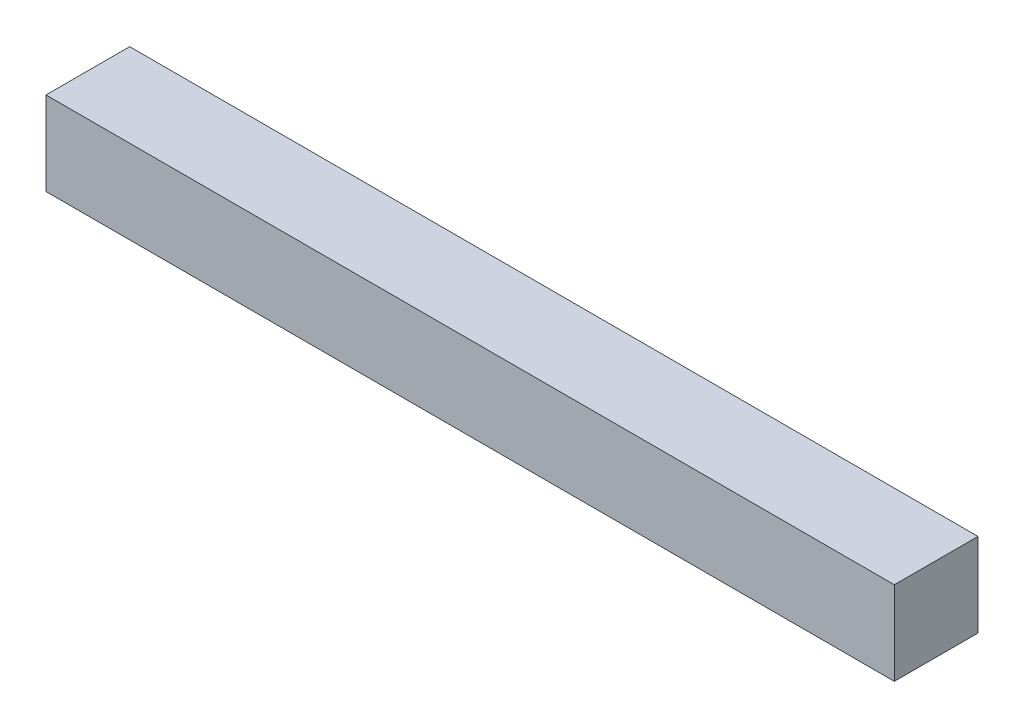
ISO-10303-21;
HEADER;
FILE_DESCRIPTION(('STEP AP214'),'2;1');
FILE_NAME('part.step','',(''),(''),'','','');
FILE_SCHEMA(('AUTOMOTIVE_DESIGN { 1 0 10303 214 1 1 1 1 }'));
ENDSEC;
DATA;
#1=APPLICATION_CONTEXT('core data for automotive mechanical design processes');
#2=APPLICATION_PROTOCOL_DEFINITION('international standard','automotive_design',2000,#1);
#3=PRODUCT_CONTEXT('',#1,'mechanical');
#4=PRODUCT('Part','Part','',(#3));
#5=PRODUCT_RELATED_PRODUCT_CATEGORY('part','',(#4));
#6=PRODUCT_DEFINITION_FORMATION('','',#4);
#7=PRODUCT_DEFINITION_CONTEXT('part definition',#1,'design');
#8=PRODUCT_DEFINITION('design','',#6,#7);
#9=PRODUCT_DEFINITION_SHAPE('','',#8);
#10=(LENGTH_UNIT() NAMED_UNIT(*) SI_UNIT(.MILLI.,.METRE.));
#11=(NAMED_UNIT(*) PLANE_ANGLE_UNIT() SI_UNIT($,.RADIAN.));
#12=(NAMED_UNIT(*) SI_UNIT($,.STERADIAN.) SOLID_ANGLE_UNIT());
#13=UNCERTAINTY_MEASURE_WITH_UNIT(LENGTH_MEASURE(1.E-05),#10,'distance_accuracy_value','');
#14=(GEOMETRIC_REPRESENTATION_CONTEXT(3) GLOBAL_UNCERTAINTY_ASSIGNED_CONTEXT((#13)) GLOBAL_UNIT_ASSIGNED_CONTEXT((#10,
#11,#12)) REPRESENTATION_CONTEXT('',''));
#15=CARTESIAN_POINT('',(0.,0.,0.));
#16=DIRECTION('',(0.,0.,1.));
#17=DIRECTION('',(1.,0.,0.));
#18=AXIS2_PLACEMENT_3D('',#15,#16,#17);
#19=CARTESIAN_POINT('',(-25.35,9.,6.));
#20=DIRECTION('',(0.,1.,0.));
#21=DIRECTION('',(-1.,0.,0.));
#22=AXIS2_PLACEMENT_3D('',#19,#20,#21);
#23=PLANE('',#22);
#24=DIRECTION('',(1.,0.,0.));
#25=VECTOR('',#24,1.);
#26=CARTESIAN_POINT('',(-25.35,9.,1.));
#27=LINE('',#26,#25);
#28=CARTESIAN_POINT('',(-25.35,9.,1.));
#29=VERTEX_POINT('',#28);
#30=CARTESIAN_POINT('',(25.35,9.,1.));
#31=VERTEX_POINT('',#30);
#32=EDGE_CURVE('E102',#29,#31,#27,.T.);
#33=ORIENTED_EDGE('',*,*,#32,.T.);
#34=DIRECTION('',(0.,0.,-1.));
#35=VECTOR('',#34,1.);
#36=CARTESIAN_POINT('',(25.35,9.,6.));
#37=LINE('',#36,#35);
#38=CARTESIAN_POINT('',(25.35,9.,6.));
#39=VERTEX_POINT('',#38);
#40=EDGE_CURVE('E11',#39,#31,#37,.T.);
#41=ORIENTED_EDGE('',*,*,#40,.F.);
#42=DIRECTION('',(1.,0.,0.));
#43=VECTOR('',#42,1.);
#44=CARTESIAN_POINT('',(-25.35,9.,6.));
#45=LINE('',#44,#43);
#46=CARTESIAN_POINT('',(-25.35,9.,6.));
#47=VERTEX_POINT('',#46);
#48=EDGE_CURVE('E90',#47,#39,#45,.T.);
#49=ORIENTED_EDGE('',*,*,#48,.F.);
#50=DIRECTION('',(0.,0.,-1.));
#51=VECTOR('',#50,1.);
#52=CARTESIAN_POINT('',(-25.35,9.,6.));
#53=LINE('',#52,#51);
#54=EDGE_CURVE('E98',#47,#29,#53,.T.);
#55=ORIENTED_EDGE('',*,*,#54,.T.);
#56=EDGE_LOOP('',(#33,#41,#49,#55));
#57=FACE_BOUND('',#56,.T.);
#58=ADVANCED_FACE('F39',(#57),#23,.F.);
#59=CARTESIAN_POINT('',(25.35,9.,6.));
#60=DIRECTION('',(-1.,0.,0.));
#61=DIRECTION('',(0.,0.,1.));
#62=AXIS2_PLACEMENT_3D('',#59,#60,#61);
#63=PLANE('',#62);
#64=DIRECTION('',(0.,1.,0.));
#65=VECTOR('',#64,1.);
#66=CARTESIAN_POINT('',(25.35,9.,1.));
#67=LINE('',#66,#65);
#68=CARTESIAN_POINT('',(25.35,14.,1.));
#69=VERTEX_POINT('',#68);
#70=EDGE_CURVE('E94',#31,#69,#67,.T.);
#71=ORIENTED_EDGE('',*,*,#70,.T.);
#72=DIRECTION('',(0.,0.,-1.));
#73=VECTOR('',#72,1.);
#74=CARTESIAN_POINT('',(25.35,14.,6.));
#75=LINE('',#74,#73);
#76=CARTESIAN_POINT('',(25.35,14.,6.));
#77=VERTEX_POINT('',#76);
#78=EDGE_CURVE('E47',#77,#69,#75,.T.);
#79=ORIENTED_EDGE('',*,*,#78,.F.);
#80=DIRECTION('',(0.,1.,0.));
#81=VECTOR('',#80,1.);
#82=CARTESIAN_POINT('',(25.35,9.,6.));
#83=LINE('',#82,#81);
#84=EDGE_CURVE('E85',#39,#77,#83,.T.);
#85=ORIENTED_EDGE('',*,*,#84,.F.);
#86=ORIENTED_EDGE('',*,*,#40,.T.);
#87=EDGE_LOOP('',(#71,#79,#85,#86));
#88=FACE_BOUND('',#87,.T.);
#89=ADVANCED_FACE('F93',(#88),#63,.F.);
#90=CARTESIAN_POINT('',(25.35,14.,6.));
#91=DIRECTION('',(0.,-1.,0.));
#92=DIRECTION('',(0.,0.,-1.));
#93=AXIS2_PLACEMENT_3D('',#90,#91,#92);
#94=PLANE('',#93);
#95=DIRECTION('',(-1.,0.,0.));
#96=VECTOR('',#95,1.);
#97=CARTESIAN_POINT('',(25.35,14.,1.));
#98=LINE('',#97,#96);
#99=CARTESIAN_POINT('',(-25.35,14.,1.));
#100=VERTEX_POINT('',#99);
#101=EDGE_CURVE('E72',#69,#100,#98,.T.);
#102=ORIENTED_EDGE('',*,*,#101,.T.);
#103=DIRECTION('',(0.,0.,-1.));
#104=VECTOR('',#103,1.);
#105=CARTESIAN_POINT('',(-25.35,14.,6.));
#106=LINE('',#105,#104);
#107=CARTESIAN_POINT('',(-25.35,14.,6.));
#108=VERTEX_POINT('',#107);
#109=EDGE_CURVE('E95',#108,#100,#106,.T.);
#110=ORIENTED_EDGE('',*,*,#109,.F.);
#111=DIRECTION('',(-1.,0.,0.));
#112=VECTOR('',#111,1.);
#113=CARTESIAN_POINT('',(25.35,14.,6.));
#114=LINE('',#113,#112);
#115=EDGE_CURVE('E88',#77,#108,#114,.T.);
#116=ORIENTED_EDGE('',*,*,#115,.F.);
#117=ORIENTED_EDGE('',*,*,#78,.T.);
#118=EDGE_LOOP('',(#102,#110,#116,#117));
#119=FACE_BOUND('',#118,.T.);
#120=ADVANCED_FACE('F96',(#119),#94,.F.);
#121=CARTESIAN_POINT('',(-25.35,14.,6.));
#122=DIRECTION('',(1.,0.,0.));
#123=DIRECTION('',(0.,0.,-1.));
#124=AXIS2_PLACEMENT_3D('',#121,#122,#123);
#125=PLANE('',#124);
#126=DIRECTION('',(0.,-1.,0.));
#127=VECTOR('',#126,1.);
#128=CARTESIAN_POINT('',(-25.35,14.,1.));
#129=LINE('',#128,#127);
#130=EDGE_CURVE('E78',#100,#29,#129,.T.);
#131=ORIENTED_EDGE('',*,*,#130,.T.);
#132=ORIENTED_EDGE('',*,*,#54,.F.);
#133=DIRECTION('',(0.,-1.,0.));
#134=VECTOR('',#133,1.);
#135=CARTESIAN_POINT('',(-25.35,14.,6.));
#136=LINE('',#135,#134);
#137=EDGE_CURVE('E55',#108,#47,#136,.T.);
#138=ORIENTED_EDGE('',*,*,#137,.F.);
#139=ORIENTED_EDGE('',*,*,#109,.T.);
#140=EDGE_LOOP('',(#131,#132,#138,#139));
#141=FACE_BOUND('',#140,.T.);
#142=ADVANCED_FACE('F109',(#141),#125,.F.);
#143=CARTESIAN_POINT('',(0.,0.,6.));
#144=DIRECTION('',(0.,0.,1.));
#145=DIRECTION('',(1.,0.,0.));
#146=AXIS2_PLACEMENT_3D('',#143,#144,#145);
#147=PLANE('',#146);
#148=ORIENTED_EDGE('',*,*,#48,.T.);
#149=ORIENTED_EDGE('',*,*,#84,.T.);
#150=ORIENTED_EDGE('',*,*,#115,.T.);
#151=ORIENTED_EDGE('',*,*,#137,.T.);
#152=EDGE_LOOP('',(#148,#149,#150,#151));
#153=FACE_BOUND('',#152,.T.);
#154=ADVANCED_FACE('F86',(#153),#147,.T.);
#155=CARTESIAN_POINT('',(0.,0.,1.));
#156=DIRECTION('',(0.,0.,1.));
#157=DIRECTION('',(1.,0.,0.));
#158=AXIS2_PLACEMENT_3D('',#155,#156,#157);
#159=PLANE('',#158);
#160=ORIENTED_EDGE('',*,*,#32,.F.);
#161=ORIENTED_EDGE('',*,*,#130,.F.);
#162=ORIENTED_EDGE('',*,*,#101,.F.);
#163=ORIENTED_EDGE('',*,*,#70,.F.);
#164=EDGE_LOOP('',(#160,#161,#162,#163));
#165=FACE_BOUND('',#164,.T.);
#166=ADVANCED_FACE('F112',(#165),#159,.F.);
#167=CLOSED_SHELL('',(#58,#89,#120,#142,#154,#166));
#168=MANIFOLD_SOLID_BREP('B2',#167);
#169=ADVANCED_BREP_SHAPE_REPRESENTATION('',(#18,#168),#14);
#170=SHAPE_DEFINITION_REPRESENTATION(#9,#169);
ENDSEC;
END-ISO-10303-21;
